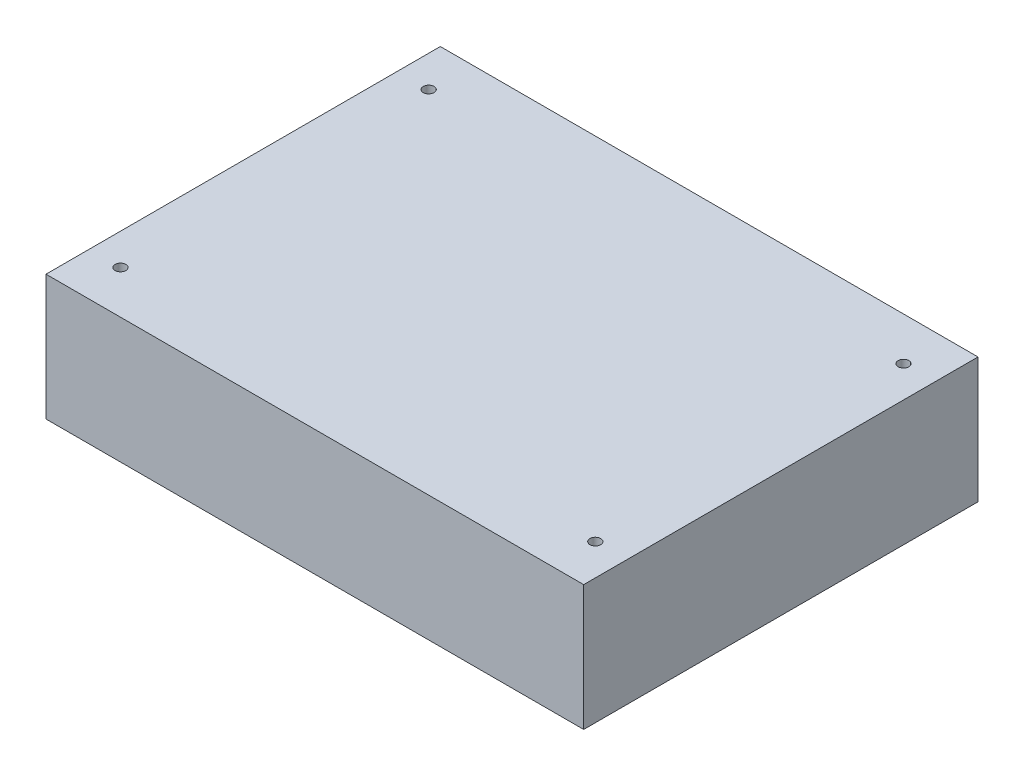
ISO-10303-21;
HEADER;
FILE_DESCRIPTION(('STEP AP214'),'2;1');
FILE_NAME('part.step','',(''),(''),'','','');
FILE_SCHEMA(('AUTOMOTIVE_DESIGN { 1 0 10303 214 1 1 1 1 }'));
ENDSEC;
DATA;
#1=APPLICATION_CONTEXT('core data for automotive mechanical design processes');
#2=APPLICATION_PROTOCOL_DEFINITION('international standard','automotive_design',2000,#1);
#3=PRODUCT_CONTEXT('',#1,'mechanical');
#4=PRODUCT('Part','Part','',(#3));
#5=PRODUCT_RELATED_PRODUCT_CATEGORY('part','',(#4));
#6=PRODUCT_DEFINITION_FORMATION('','',#4);
#7=PRODUCT_DEFINITION_CONTEXT('part definition',#1,'design');
#8=PRODUCT_DEFINITION('design','',#6,#7);
#9=PRODUCT_DEFINITION_SHAPE('','',#8);
#10=(LENGTH_UNIT() NAMED_UNIT(*) SI_UNIT(.MILLI.,.METRE.));
#11=(NAMED_UNIT(*) PLANE_ANGLE_UNIT() SI_UNIT($,.RADIAN.));
#12=(NAMED_UNIT(*) SI_UNIT($,.STERADIAN.) SOLID_ANGLE_UNIT());
#13=UNCERTAINTY_MEASURE_WITH_UNIT(LENGTH_MEASURE(1.E-05),#10,'distance_accuracy_value','');
#14=(GEOMETRIC_REPRESENTATION_CONTEXT(3) GLOBAL_UNCERTAINTY_ASSIGNED_CONTEXT((#13)) GLOBAL_UNIT_ASSIGNED_CONTEXT((#10,
#11,#12)) REPRESENTATION_CONTEXT('',''));
#15=CARTESIAN_POINT('',(0.,0.,0.));
#16=DIRECTION('',(0.,0.,1.));
#17=DIRECTION('',(1.,0.,0.));
#18=AXIS2_PLACEMENT_3D('',#15,#16,#17);
#19=CARTESIAN_POINT('',(75.,35.,55.));
#20=DIRECTION('',(-1.,0.,0.));
#21=DIRECTION('',(0.,0.,1.));
#22=AXIS2_PLACEMENT_3D('',#19,#20,#21);
#23=PLANE('',#22);
#24=DIRECTION('',(0.,0.,-1.));
#25=VECTOR('',#24,1.);
#26=CARTESIAN_POINT('',(75.,0.,55.));
#27=LINE('',#26,#25);
#28=CARTESIAN_POINT('',(75.,0.,55.));
#29=VERTEX_POINT('',#28);
#30=CARTESIAN_POINT('',(75.,0.,-55.));
#31=VERTEX_POINT('',#30);
#32=EDGE_CURVE('E113',#29,#31,#27,.T.);
#33=ORIENTED_EDGE('',*,*,#32,.T.);
#34=DIRECTION('',(0.,-1.,0.));
#35=VECTOR('',#34,1.);
#36=CARTESIAN_POINT('',(75.,35.,-55.));
#37=LINE('',#36,#35);
#38=CARTESIAN_POINT('',(75.,35.,-55.));
#39=VERTEX_POINT('',#38);
#40=EDGE_CURVE('E11',#39,#31,#37,.T.);
#41=ORIENTED_EDGE('',*,*,#40,.F.);
#42=DIRECTION('',(0.,0.,-1.));
#43=VECTOR('',#42,1.);
#44=CARTESIAN_POINT('',(75.,35.,55.));
#45=LINE('',#44,#43);
#46=CARTESIAN_POINT('',(75.,35.,55.));
#47=VERTEX_POINT('',#46);
#48=EDGE_CURVE('E97',#47,#39,#45,.T.);
#49=ORIENTED_EDGE('',*,*,#48,.F.);
#50=DIRECTION('',(0.,-1.,0.));
#51=VECTOR('',#50,1.);
#52=CARTESIAN_POINT('',(75.,35.,55.));
#53=LINE('',#52,#51);
#54=EDGE_CURVE('E109',#47,#29,#53,.T.);
#55=ORIENTED_EDGE('',*,*,#54,.T.);
#56=EDGE_LOOP('',(#33,#41,#49,#55));
#57=FACE_BOUND('',#56,.T.);
#58=ADVANCED_FACE('F45',(#57),#23,.F.);
#59=CARTESIAN_POINT('',(-75.,35.,-55.));
#60=DIRECTION('',(0.,0.,1.));
#61=DIRECTION('',(1.,0.,0.));
#62=AXIS2_PLACEMENT_3D('',#59,#60,#61);
#63=PLANE('',#62);
#64=DIRECTION('',(-1.,0.,0.));
#65=VECTOR('',#64,1.);
#66=CARTESIAN_POINT('',(-75.,0.,-55.));
#67=LINE('',#66,#65);
#68=CARTESIAN_POINT('',(-75.,0.,-55.));
#69=VERTEX_POINT('',#68);
#70=EDGE_CURVE('E102',#31,#69,#67,.T.);
#71=ORIENTED_EDGE('',*,*,#70,.T.);
#72=DIRECTION('',(0.,-1.,0.));
#73=VECTOR('',#72,1.);
#74=CARTESIAN_POINT('',(-75.,35.,-55.));
#75=LINE('',#74,#73);
#76=CARTESIAN_POINT('',(-75.,35.,-55.));
#77=VERTEX_POINT('',#76);
#78=EDGE_CURVE('E54',#77,#69,#75,.T.);
#79=ORIENTED_EDGE('',*,*,#78,.F.);
#80=DIRECTION('',(-1.,0.,0.));
#81=VECTOR('',#80,1.);
#82=CARTESIAN_POINT('',(-75.,35.,-55.));
#83=LINE('',#82,#81);
#84=EDGE_CURVE('E92',#39,#77,#83,.T.);
#85=ORIENTED_EDGE('',*,*,#84,.F.);
#86=ORIENTED_EDGE('',*,*,#40,.T.);
#87=EDGE_LOOP('',(#71,#79,#85,#86));
#88=FACE_BOUND('',#87,.T.);
#89=ADVANCED_FACE('F101',(#88),#63,.F.);
#90=CARTESIAN_POINT('',(-75.,35.,55.));
#91=DIRECTION('',(1.,0.,0.));
#92=DIRECTION('',(0.,0.,-1.));
#93=AXIS2_PLACEMENT_3D('',#90,#91,#92);
#94=PLANE('',#93);
#95=DIRECTION('',(0.,0.,1.));
#96=VECTOR('',#95,1.);
#97=CARTESIAN_POINT('',(-75.,0.,55.));
#98=LINE('',#97,#96);
#99=CARTESIAN_POINT('',(-75.,0.,55.));
#100=VERTEX_POINT('',#99);
#101=EDGE_CURVE('E79',#69,#100,#98,.T.);
#102=ORIENTED_EDGE('',*,*,#101,.T.);
#103=DIRECTION('',(0.,-1.,0.));
#104=VECTOR('',#103,1.);
#105=CARTESIAN_POINT('',(-75.,35.,55.));
#106=LINE('',#105,#104);
#107=CARTESIAN_POINT('',(-75.,35.,55.));
#108=VERTEX_POINT('',#107);
#109=EDGE_CURVE('E104',#108,#100,#106,.T.);
#110=ORIENTED_EDGE('',*,*,#109,.F.);
#111=DIRECTION('',(0.,0.,1.));
#112=VECTOR('',#111,1.);
#113=CARTESIAN_POINT('',(-75.,35.,55.));
#114=LINE('',#113,#112);
#115=EDGE_CURVE('E95',#77,#108,#114,.T.);
#116=ORIENTED_EDGE('',*,*,#115,.F.);
#117=ORIENTED_EDGE('',*,*,#78,.T.);
#118=EDGE_LOOP('',(#102,#110,#116,#117));
#119=FACE_BOUND('',#118,.T.);
#120=ADVANCED_FACE('F105',(#119),#94,.F.);
#121=CARTESIAN_POINT('',(-75.,35.,55.));
#122=DIRECTION('',(0.,0.,-1.));
#123=DIRECTION('',(-1.,0.,0.));
#124=AXIS2_PLACEMENT_3D('',#121,#122,#123);
#125=PLANE('',#124);
#126=DIRECTION('',(1.,0.,0.));
#127=VECTOR('',#126,1.);
#128=CARTESIAN_POINT('',(-75.,0.,55.));
#129=LINE('',#128,#127);
#130=EDGE_CURVE('E85',#100,#29,#129,.T.);
#131=ORIENTED_EDGE('',*,*,#130,.T.);
#132=ORIENTED_EDGE('',*,*,#54,.F.);
#133=DIRECTION('',(1.,0.,0.));
#134=VECTOR('',#133,1.);
#135=CARTESIAN_POINT('',(-75.,35.,55.));
#136=LINE('',#135,#134);
#137=EDGE_CURVE('E62',#108,#47,#136,.T.);
#138=ORIENTED_EDGE('',*,*,#137,.F.);
#139=ORIENTED_EDGE('',*,*,#109,.T.);
#140=EDGE_LOOP('',(#131,#132,#138,#139));
#141=FACE_BOUND('',#140,.T.);
#142=ADVANCED_FACE('F127',(#141),#125,.F.);
#143=CARTESIAN_POINT('',(0.,35.,0.));
#144=DIRECTION('',(0.,-1.,0.));
#145=DIRECTION('',(0.,0.,-1.));
#146=AXIS2_PLACEMENT_3D('',#143,#144,#145);
#147=PLANE('',#146);
#148=CARTESIAN_POINT('',(66.2305,35.,-42.9895));
#149=DIRECTION('',(0.,1.,0.));
#150=DIRECTION('',(0.,0.,1.));
#151=AXIS2_PLACEMENT_3D('',#148,#149,#150);
#152=CIRCLE('',#151,1.5);
#153=CARTESIAN_POINT('',(66.2305,35.,-41.4895));
#154=VERTEX_POINT('',#153);
#155=EDGE_CURVE('E146',#154,#154,#152,.T.);
#156=ORIENTED_EDGE('',*,*,#155,.F.);
#157=EDGE_LOOP('',(#156));
#158=FACE_BOUND('',#157,.T.);
#159=CARTESIAN_POINT('',(66.2305,35.,42.9895));
#160=DIRECTION('',(0.,1.,0.));
#161=DIRECTION('',(0.,0.,1.));
#162=AXIS2_PLACEMENT_3D('',#159,#160,#161);
#163=CIRCLE('',#162,1.5);
#164=CARTESIAN_POINT('',(66.2305,35.,44.4895));
#165=VERTEX_POINT('',#164);
#166=EDGE_CURVE('E154',#165,#165,#163,.T.);
#167=ORIENTED_EDGE('',*,*,#166,.F.);
#168=EDGE_LOOP('',(#167));
#169=FACE_BOUND('',#168,.T.);
#170=CARTESIAN_POINT('',(-66.2305,35.,42.9895));
#171=DIRECTION('',(0.,1.,0.));
#172=DIRECTION('',(0.,0.,1.));
#173=AXIS2_PLACEMENT_3D('',#170,#171,#172);
#174=CIRCLE('',#173,1.5);
#175=CARTESIAN_POINT('',(-66.2305,35.,44.4895));
#176=VERTEX_POINT('',#175);
#177=EDGE_CURVE('E138',#176,#176,#174,.T.);
#178=ORIENTED_EDGE('',*,*,#177,.F.);
#179=EDGE_LOOP('',(#178));
#180=FACE_BOUND('',#179,.T.);
#181=CARTESIAN_POINT('',(-66.2305,35.,-42.9895));
#182=DIRECTION('',(0.,1.,0.));
#183=DIRECTION('',(0.,0.,1.));
#184=AXIS2_PLACEMENT_3D('',#181,#182,#183);
#185=CIRCLE('',#184,1.5);
#186=CARTESIAN_POINT('',(-66.2305,35.,-41.4895));
#187=VERTEX_POINT('',#186);
#188=EDGE_CURVE('E134',#187,#187,#185,.T.);
#189=ORIENTED_EDGE('',*,*,#188,.F.);
#190=EDGE_LOOP('',(#189));
#191=FACE_BOUND('',#190,.T.);
#192=ORIENTED_EDGE('',*,*,#48,.T.);
#193=ORIENTED_EDGE('',*,*,#84,.T.);
#194=ORIENTED_EDGE('',*,*,#115,.T.);
#195=ORIENTED_EDGE('',*,*,#137,.T.);
#196=EDGE_LOOP('',(#192,#193,#194,#195));
#197=FACE_BOUND('',#196,.T.);
#198=ADVANCED_FACE('F93',(#158,#169,#180,#191,#197),#147,.F.);
#199=CARTESIAN_POINT('',(0.,0.,0.));
#200=DIRECTION('',(0.,-1.,0.));
#201=DIRECTION('',(0.,0.,-1.));
#202=AXIS2_PLACEMENT_3D('',#199,#200,#201);
#203=PLANE('',#202);
#204=CARTESIAN_POINT('',(66.2305,0.,-42.9895));
#205=DIRECTION('',(0.,1.,0.));
#206=DIRECTION('',(0.,0.,1.));
#207=AXIS2_PLACEMENT_3D('',#204,#205,#206);
#208=CIRCLE('',#207,1.5);
#209=CARTESIAN_POINT('',(66.2305,0.,-41.4895));
#210=VERTEX_POINT('',#209);
#211=EDGE_CURVE('E142',#210,#210,#208,.T.);
#212=ORIENTED_EDGE('',*,*,#211,.T.);
#213=EDGE_LOOP('',(#212));
#214=FACE_BOUND('',#213,.T.);
#215=CARTESIAN_POINT('',(66.2305,0.,42.9895));
#216=DIRECTION('',(0.,1.,0.));
#217=DIRECTION('',(0.,0.,1.));
#218=AXIS2_PLACEMENT_3D('',#215,#216,#217);
#219=CIRCLE('',#218,1.5);
#220=CARTESIAN_POINT('',(66.2305,0.,44.4895));
#221=VERTEX_POINT('',#220);
#222=EDGE_CURVE('E150',#221,#221,#219,.T.);
#223=ORIENTED_EDGE('',*,*,#222,.T.);
#224=EDGE_LOOP('',(#223));
#225=FACE_BOUND('',#224,.T.);
#226=CARTESIAN_POINT('',(-66.2305,0.,42.9895));
#227=DIRECTION('',(0.,1.,0.));
#228=DIRECTION('',(0.,0.,1.));
#229=AXIS2_PLACEMENT_3D('',#226,#227,#228);
#230=CIRCLE('',#229,1.5);
#231=CARTESIAN_POINT('',(-66.2305,0.,44.4895));
#232=VERTEX_POINT('',#231);
#233=EDGE_CURVE('E158',#232,#232,#230,.T.);
#234=ORIENTED_EDGE('',*,*,#233,.T.);
#235=EDGE_LOOP('',(#234));
#236=FACE_BOUND('',#235,.T.);
#237=CARTESIAN_POINT('',(-66.2305,0.,-42.9895));
#238=DIRECTION('',(0.,1.,0.));
#239=DIRECTION('',(0.,0.,1.));
#240=AXIS2_PLACEMENT_3D('',#237,#238,#239);
#241=CIRCLE('',#240,1.5);
#242=CARTESIAN_POINT('',(-66.2305,0.,-41.4895));
#243=VERTEX_POINT('',#242);
#244=EDGE_CURVE('E117',#243,#243,#241,.T.);
#245=ORIENTED_EDGE('',*,*,#244,.T.);
#246=EDGE_LOOP('',(#245));
#247=FACE_BOUND('',#246,.T.);
#248=ORIENTED_EDGE('',*,*,#32,.F.);
#249=ORIENTED_EDGE('',*,*,#130,.F.);
#250=ORIENTED_EDGE('',*,*,#101,.F.);
#251=ORIENTED_EDGE('',*,*,#70,.F.);
#252=EDGE_LOOP('',(#248,#249,#250,#251));
#253=FACE_BOUND('',#252,.T.);
#254=ADVANCED_FACE('F130',(#214,#225,#236,#247,#253),#203,.T.);
#255=CARTESIAN_POINT('',(-66.2305,0.,-42.9895));
#256=DIRECTION('',(0.,1.,0.));
#257=DIRECTION('',(0.,0.,1.));
#258=AXIS2_PLACEMENT_3D('',#255,#256,#257);
#259=CYLINDRICAL_SURFACE('',#258,1.5);
#260=ORIENTED_EDGE('',*,*,#244,.F.);
#261=EDGE_LOOP('',(#260));
#262=FACE_BOUND('',#261,.T.);
#263=ORIENTED_EDGE('',*,*,#188,.T.);
#264=EDGE_LOOP('',(#263));
#265=FACE_BOUND('',#264,.T.);
#266=ADVANCED_FACE('F174',(#262,#265),#259,.F.);
#267=CARTESIAN_POINT('',(-66.2305,0.,42.9895));
#268=DIRECTION('',(0.,1.,0.));
#269=DIRECTION('',(0.,0.,1.));
#270=AXIS2_PLACEMENT_3D('',#267,#268,#269);
#271=CYLINDRICAL_SURFACE('',#270,1.5);
#272=ORIENTED_EDGE('',*,*,#233,.F.);
#273=EDGE_LOOP('',(#272));
#274=FACE_BOUND('',#273,.T.);
#275=ORIENTED_EDGE('',*,*,#177,.T.);
#276=EDGE_LOOP('',(#275));
#277=FACE_BOUND('',#276,.T.);
#278=ADVANCED_FACE('F166',(#274,#277),#271,.F.);
#279=CARTESIAN_POINT('',(66.2305,0.,42.9895));
#280=DIRECTION('',(0.,1.,0.));
#281=DIRECTION('',(0.,0.,1.));
#282=AXIS2_PLACEMENT_3D('',#279,#280,#281);
#283=CYLINDRICAL_SURFACE('',#282,1.5);
#284=ORIENTED_EDGE('',*,*,#222,.F.);
#285=EDGE_LOOP('',(#284));
#286=FACE_BOUND('',#285,.T.);
#287=ORIENTED_EDGE('',*,*,#166,.T.);
#288=EDGE_LOOP('',(#287));
#289=FACE_BOUND('',#288,.T.);
#290=ADVANCED_FACE('F182',(#286,#289),#283,.F.);
#291=CARTESIAN_POINT('',(66.2305,0.,-42.9895));
#292=DIRECTION('',(0.,1.,0.));
#293=DIRECTION('',(0.,0.,1.));
#294=AXIS2_PLACEMENT_3D('',#291,#292,#293);
#295=CYLINDRICAL_SURFACE('',#294,1.5);
#296=ORIENTED_EDGE('',*,*,#211,.F.);
#297=EDGE_LOOP('',(#296));
#298=FACE_BOUND('',#297,.T.);
#299=ORIENTED_EDGE('',*,*,#155,.T.);
#300=EDGE_LOOP('',(#299));
#301=FACE_BOUND('',#300,.T.);
#302=ADVANCED_FACE('F233',(#298,#301),#295,.F.);
#303=CLOSED_SHELL('',(#58,#89,#120,#142,#198,#254,#266,#278,#290,#302));
#304=MANIFOLD_SOLID_BREP('B2',#303);
#305=ADVANCED_BREP_SHAPE_REPRESENTATION('',(#18,#304),#14);
#306=SHAPE_DEFINITION_REPRESENTATION(#9,#305);
ENDSEC;
END-ISO-10303-21;
